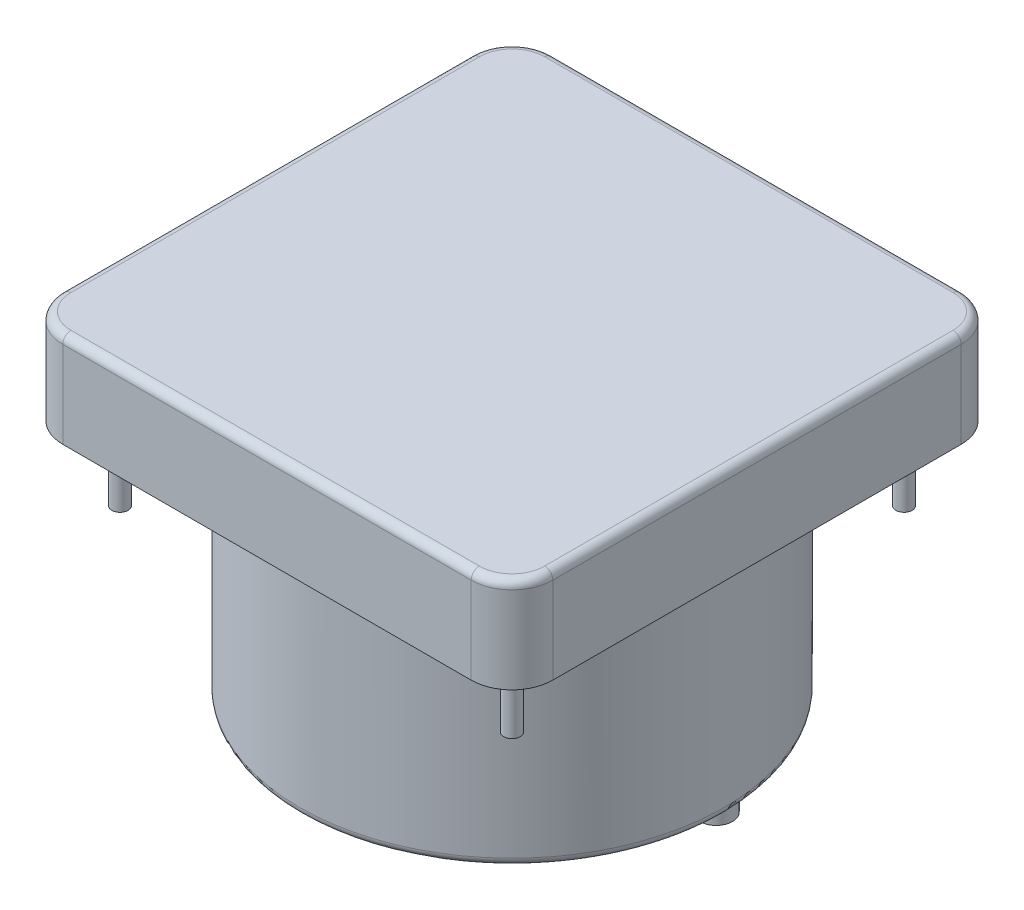
ISO-10303-21;
HEADER;
FILE_DESCRIPTION(('STEP AP214'),'2;1');
FILE_NAME('part.step','',(''),(''),'','','');
FILE_SCHEMA(('AUTOMOTIVE_DESIGN { 1 0 10303 214 1 1 1 1 }'));
ENDSEC;
DATA;
#1=APPLICATION_CONTEXT('core data for automotive mechanical design processes');
#2=APPLICATION_PROTOCOL_DEFINITION('international standard','automotive_design',2000,#1);
#3=PRODUCT_CONTEXT('',#1,'mechanical');
#4=PRODUCT('Part','Part','',(#3));
#5=PRODUCT_RELATED_PRODUCT_CATEGORY('part','',(#4));
#6=PRODUCT_DEFINITION_FORMATION('','',#4);
#7=PRODUCT_DEFINITION_CONTEXT('part definition',#1,'design');
#8=PRODUCT_DEFINITION('design','',#6,#7);
#9=PRODUCT_DEFINITION_SHAPE('','',#8);
#10=(LENGTH_UNIT() NAMED_UNIT(*) SI_UNIT(.MILLI.,.METRE.));
#11=(NAMED_UNIT(*) PLANE_ANGLE_UNIT() SI_UNIT($,.RADIAN.));
#12=(NAMED_UNIT(*) SI_UNIT($,.STERADIAN.) SOLID_ANGLE_UNIT());
#13=UNCERTAINTY_MEASURE_WITH_UNIT(LENGTH_MEASURE(1.E-05),#10,'distance_accuracy_value','');
#14=(GEOMETRIC_REPRESENTATION_CONTEXT(3) GLOBAL_UNCERTAINTY_ASSIGNED_CONTEXT((#13)) GLOBAL_UNIT_ASSIGNED_CONTEXT((#10,
#11,#12)) REPRESENTATION_CONTEXT('',''));
#15=CARTESIAN_POINT('',(0.,0.,0.));
#16=DIRECTION('',(0.,0.,1.));
#17=DIRECTION('',(1.,0.,0.));
#18=AXIS2_PLACEMENT_3D('',#15,#16,#17);
#19=CARTESIAN_POINT('',(0.,29.,0.));
#20=DIRECTION('',(0.,-1.,0.));
#21=DIRECTION('',(0.,0.,-1.));
#22=AXIS2_PLACEMENT_3D('',#19,#20,#21);
#23=CYLINDRICAL_SURFACE('',#22,26.);
#24=CARTESIAN_POINT('',(0.,1.,0.));
#25=DIRECTION('',(0.,1.,0.));
#26=DIRECTION('',(0.,0.,1.));
#27=AXIS2_PLACEMENT_3D('',#24,#25,#26);
#28=CIRCLE('',#27,26.);
#29=CARTESIAN_POINT('',(0.,1.,-26.));
#30=VERTEX_POINT('',#29);
#31=EDGE_CURVE('E212',#30,#30,#28,.T.);
#32=CARTESIAN_POINT('',(0.,29.,0.));
#33=DIRECTION('',(0.,1.,0.));
#34=DIRECTION('',(0.,0.,1.));
#35=AXIS2_PLACEMENT_3D('',#32,#33,#34);
#36=CIRCLE('',#35,26.);
#37=CARTESIAN_POINT('',(0.,29.,-26.));
#38=VERTEX_POINT('',#37);
#39=EDGE_CURVE('E158',#38,#38,#36,.T.);
#40=CARTESIAN_POINT('',(0.,1.,-26.));
#41=CARTESIAN_POINT('',(0.,1.29166666666667,-26.));
#42=CARTESIAN_POINT('',(0.,1.58333333333333,-26.));
#43=CARTESIAN_POINT('',(0.,2.16666666666667,-26.));
#44=CARTESIAN_POINT('',(0.,2.45833333333334,-26.));
#45=CARTESIAN_POINT('',(0.,3.04166666666667,-26.));
#46=CARTESIAN_POINT('',(0.,3.33333333333334,-26.));
#47=CARTESIAN_POINT('',(0.,3.91666666666667,-26.));
#48=CARTESIAN_POINT('',(0.,4.20833333333333,-26.));
#49=CARTESIAN_POINT('',(0.,4.79166666666667,-26.));
#50=CARTESIAN_POINT('',(0.,5.08333333333333,-26.));
#51=CARTESIAN_POINT('',(0.,5.66666666666667,-26.));
#52=CARTESIAN_POINT('',(0.,5.95833333333334,-26.));
#53=CARTESIAN_POINT('',(0.,6.54166666666667,-26.));
#54=CARTESIAN_POINT('',(0.,6.83333333333334,-26.));
#55=CARTESIAN_POINT('',(0.,7.41666666666667,-26.));
#56=CARTESIAN_POINT('',(0.,7.70833333333333,-26.));
#57=CARTESIAN_POINT('',(0.,8.29166666666667,-26.));
#58=CARTESIAN_POINT('',(0.,8.58333333333333,-26.));
#59=CARTESIAN_POINT('',(0.,9.16666666666667,-26.));
#60=CARTESIAN_POINT('',(0.,9.45833333333333,-26.));
#61=CARTESIAN_POINT('',(0.,10.0416666666667,-26.));
#62=CARTESIAN_POINT('',(0.,10.3333333333333,-26.));
#63=CARTESIAN_POINT('',(0.,10.9166666666667,-26.));
#64=CARTESIAN_POINT('',(0.,11.2083333333333,-26.));
#65=CARTESIAN_POINT('',(0.,11.7916666666667,-26.));
#66=CARTESIAN_POINT('',(0.,12.0833333333333,-26.));
#67=CARTESIAN_POINT('',(0.,12.6666666666667,-26.));
#68=CARTESIAN_POINT('',(0.,12.9583333333333,-26.));
#69=CARTESIAN_POINT('',(0.,13.5416666666667,-26.));
#70=CARTESIAN_POINT('',(0.,13.8333333333333,-26.));
#71=CARTESIAN_POINT('',(0.,14.4166666666667,-26.));
#72=CARTESIAN_POINT('',(0.,14.7083333333333,-26.));
#73=CARTESIAN_POINT('',(0.,15.2916666666667,-26.));
#74=CARTESIAN_POINT('',(0.,15.5833333333333,-26.));
#75=CARTESIAN_POINT('',(0.,16.1666666666667,-26.));
#76=CARTESIAN_POINT('',(0.,16.4583333333333,-26.));
#77=CARTESIAN_POINT('',(0.,17.0416666666667,-26.));
#78=CARTESIAN_POINT('',(0.,17.3333333333333,-26.));
#79=CARTESIAN_POINT('',(0.,17.9166666666667,-26.));
#80=CARTESIAN_POINT('',(0.,18.2083333333333,-26.));
#81=CARTESIAN_POINT('',(0.,18.7916666666667,-26.));
#82=CARTESIAN_POINT('',(0.,19.0833333333333,-26.));
#83=CARTESIAN_POINT('',(0.,19.6666666666667,-26.));
#84=CARTESIAN_POINT('',(0.,19.9583333333333,-26.));
#85=CARTESIAN_POINT('',(0.,20.5416666666667,-26.));
#86=CARTESIAN_POINT('',(0.,20.8333333333333,-26.));
#87=CARTESIAN_POINT('',(0.,21.4166666666667,-26.));
#88=CARTESIAN_POINT('',(0.,21.7083333333333,-26.));
#89=CARTESIAN_POINT('',(0.,22.2916666666667,-26.));
#90=CARTESIAN_POINT('',(0.,22.5833333333333,-26.));
#91=CARTESIAN_POINT('',(0.,23.1666666666667,-26.));
#92=CARTESIAN_POINT('',(0.,23.4583333333333,-26.));
#93=CARTESIAN_POINT('',(0.,24.0416666666667,-26.));
#94=CARTESIAN_POINT('',(0.,24.3333333333333,-26.));
#95=CARTESIAN_POINT('',(0.,24.9166666666667,-26.));
#96=CARTESIAN_POINT('',(0.,25.2083333333333,-26.));
#97=CARTESIAN_POINT('',(0.,25.7916666666667,-26.));
#98=CARTESIAN_POINT('',(0.,26.0833333333333,-26.));
#99=CARTESIAN_POINT('',(0.,26.6666666666667,-26.));
#100=CARTESIAN_POINT('',(0.,26.9583333333333,-26.));
#101=CARTESIAN_POINT('',(0.,27.5416666666667,-26.));
#102=CARTESIAN_POINT('',(0.,27.8333333333333,-26.));
#103=CARTESIAN_POINT('',(0.,28.4166666666667,-26.));
#104=CARTESIAN_POINT('',(0.,28.7083333333333,-26.));
#105=CARTESIAN_POINT('',(0.,29.,-26.));
#106=B_SPLINE_CURVE_WITH_KNOTS('',3,(#40,#41,#42,#43,#44,#45,#46,#47,#48,#49,#50,#51,#52,#53,
#54,#55,#56,#57,#58,#59,#60,#61,#62,#63,#64,#65,#66,#67,#68,#69,#70,#71,#72,#73,#74,#75,#76,#77,
#78,#79,#80,#81,#82,#83,#84,#85,#86,#87,#88,#89,#90,#91,#92,#93,#94,#95,#96,#97,#98,#99,#100,
#101,#102,#103,#104,#105),.UNSPECIFIED.,.F.,.F.,(4,2,2,2,2,2,2,2,2,2,2,2,2,2,2,2,2,2,2,2,2,2,2,
2,2,2,2,2,2,2,2,2,4),(0.,0.875000000000001,1.75,2.625,3.5,4.375,5.25,6.125,7.,7.875,8.75,9.625,
10.5,11.375,12.25,13.125,14.,14.875,15.75,16.625,17.5,18.375,19.25,20.125,21.,21.875,22.75,
23.625,24.5,25.375,26.25,27.125,28.),.UNSPECIFIED.);
#107=EDGE_CURVE('BSEAM36',#30,#38,#106,.T.);
#108=ORIENTED_EDGE('',*,*,#31,.T.);
#109=ORIENTED_EDGE('',*,*,#39,.F.);
#110=ORIENTED_EDGE('',*,*,#107,.T.);
#111=ORIENTED_EDGE('',*,*,#107,.F.);
#112=EDGE_LOOP('',(#108,#110,#109,#111));
#113=FACE_BOUND('',#112,.T.);
#114=ADVANCED_FACE('F36',(#113),#23,.T.);
#115=CARTESIAN_POINT('',(0.,0.,0.));
#116=DIRECTION('',(0.,1.,0.));
#117=DIRECTION('',(0.,0.,1.));
#118=AXIS2_PLACEMENT_3D('',#115,#116,#117);
#119=PLANE('',#118);
#120=CARTESIAN_POINT('',(-15.,0.,-10.));
#121=DIRECTION('',(0.,1.,0.));
#122=DIRECTION('',(0.,0.,1.));
#123=AXIS2_PLACEMENT_3D('',#120,#121,#122);
#124=CIRCLE('',#123,5.);
#125=CARTESIAN_POINT('',(-15.,0.,-5.));
#126=VERTEX_POINT('',#125);
#127=EDGE_CURVE('E11',#126,#126,#124,.F.);
#128=ORIENTED_EDGE('',*,*,#127,.F.);
#129=EDGE_LOOP('',(#128));
#130=FACE_BOUND('',#129,.T.);
#131=CARTESIAN_POINT('',(15.,0.,-10.));
#132=DIRECTION('',(0.,1.,0.));
#133=DIRECTION('',(0.,0.,1.));
#134=AXIS2_PLACEMENT_3D('',#131,#132,#133);
#135=CIRCLE('',#134,5.);
#136=CARTESIAN_POINT('',(15.,0.,-5.));
#137=VERTEX_POINT('',#136);
#138=EDGE_CURVE('E242',#137,#137,#135,.F.);
#139=ORIENTED_EDGE('',*,*,#138,.F.);
#140=EDGE_LOOP('',(#139));
#141=FACE_BOUND('',#140,.T.);
#142=CARTESIAN_POINT('',(0.,0.,0.));
#143=DIRECTION('',(0.,1.,0.));
#144=DIRECTION('',(0.,0.,1.));
#145=AXIS2_PLACEMENT_3D('',#142,#143,#144);
#146=CIRCLE('',#145,25.);
#147=CARTESIAN_POINT('',(0.,0.,25.));
#148=VERTEX_POINT('',#147);
#149=EDGE_CURVE('E239',#148,#148,#146,.F.);
#150=ORIENTED_EDGE('',*,*,#149,.T.);
#151=EDGE_LOOP('',(#150));
#152=FACE_BOUND('',#151,.T.);
#153=ADVANCED_FACE('F266',(#130,#141,#152),#119,.F.);
#154=CARTESIAN_POINT('',(30.,40.6,30.));
#155=DIRECTION('',(-1.,0.,0.));
#156=DIRECTION('',(0.,0.,1.));
#157=AXIS2_PLACEMENT_3D('',#154,#155,#156);
#158=PLANE('',#157);
#159=DIRECTION('',(0.,-1.,0.));
#160=VECTOR('',#159,1.);
#161=CARTESIAN_POINT('',(30.,40.6,-25.));
#162=LINE('',#161,#160);
#163=CARTESIAN_POINT('',(30.,29.,-25.));
#164=VERTEX_POINT('',#163);
#165=CARTESIAN_POINT('',(30.,39.6,-25.));
#166=VERTEX_POINT('',#165);
#167=EDGE_CURVE('E179',#164,#166,#162,.F.);
#168=ORIENTED_EDGE('',*,*,#167,.T.);
#169=DIRECTION('',(0.,0.,-1.));
#170=VECTOR('',#169,1.);
#171=CARTESIAN_POINT('',(30.,39.6,30.));
#172=LINE('',#171,#170);
#173=CARTESIAN_POINT('',(30.,39.6,25.));
#174=VERTEX_POINT('',#173);
#175=EDGE_CURVE('E205',#166,#174,#172,.F.);
#176=ORIENTED_EDGE('',*,*,#175,.T.);
#177=DIRECTION('',(0.,-1.,0.));
#178=VECTOR('',#177,1.);
#179=CARTESIAN_POINT('',(30.,40.6,25.));
#180=LINE('',#179,#178);
#181=CARTESIAN_POINT('',(30.,29.,25.));
#182=VERTEX_POINT('',#181);
#183=EDGE_CURVE('E177',#174,#182,#180,.T.);
#184=ORIENTED_EDGE('',*,*,#183,.T.);
#185=DIRECTION('',(0.,0.,-1.));
#186=VECTOR('',#185,1.);
#187=CARTESIAN_POINT('',(30.,29.,30.));
#188=LINE('',#187,#186);
#189=EDGE_CURVE('E160',#182,#164,#188,.T.);
#190=ORIENTED_EDGE('',*,*,#189,.T.);
#191=EDGE_LOOP('',(#168,#176,#184,#190));
#192=FACE_BOUND('',#191,.T.);
#193=ADVANCED_FACE('F272',(#192),#158,.F.);
#194=CARTESIAN_POINT('',(-30.,40.6,-30.));
#195=DIRECTION('',(0.,0.,1.));
#196=DIRECTION('',(1.,0.,0.));
#197=AXIS2_PLACEMENT_3D('',#194,#195,#196);
#198=PLANE('',#197);
#199=DIRECTION('',(0.,-1.,0.));
#200=VECTOR('',#199,1.);
#201=CARTESIAN_POINT('',(-25.,40.6,-30.));
#202=LINE('',#201,#200);
#203=CARTESIAN_POINT('',(-25.,29.,-30.));
#204=VERTEX_POINT('',#203);
#205=CARTESIAN_POINT('',(-25.,39.6,-30.));
#206=VERTEX_POINT('',#205);
#207=EDGE_CURVE('E144',#204,#206,#202,.F.);
#208=ORIENTED_EDGE('',*,*,#207,.T.);
#209=DIRECTION('',(-1.,0.,0.));
#210=VECTOR('',#209,1.);
#211=CARTESIAN_POINT('',(-30.,39.6,-30.));
#212=LINE('',#211,#210);
#213=CARTESIAN_POINT('',(25.,39.6,-30.));
#214=VERTEX_POINT('',#213);
#215=EDGE_CURVE('E201',#206,#214,#212,.F.);
#216=ORIENTED_EDGE('',*,*,#215,.T.);
#217=DIRECTION('',(0.,-1.,0.));
#218=VECTOR('',#217,1.);
#219=CARTESIAN_POINT('',(25.,40.6,-30.));
#220=LINE('',#219,#218);
#221=CARTESIAN_POINT('',(25.,29.,-30.));
#222=VERTEX_POINT('',#221);
#223=EDGE_CURVE('E148',#214,#222,#220,.T.);
#224=ORIENTED_EDGE('',*,*,#223,.T.);
#225=DIRECTION('',(-1.,0.,0.));
#226=VECTOR('',#225,1.);
#227=CARTESIAN_POINT('',(-30.,29.,-30.));
#228=LINE('',#227,#226);
#229=EDGE_CURVE('E155',#222,#204,#228,.T.);
#230=ORIENTED_EDGE('',*,*,#229,.T.);
#231=EDGE_LOOP('',(#208,#216,#224,#230));
#232=FACE_BOUND('',#231,.T.);
#233=ADVANCED_FACE('F343',(#232),#198,.F.);
#234=CARTESIAN_POINT('',(-30.,40.6,30.));
#235=DIRECTION('',(1.,0.,0.));
#236=DIRECTION('',(0.,0.,-1.));
#237=AXIS2_PLACEMENT_3D('',#234,#235,#236);
#238=PLANE('',#237);
#239=DIRECTION('',(0.,-1.,0.));
#240=VECTOR('',#239,1.);
#241=CARTESIAN_POINT('',(-30.,40.6,25.));
#242=LINE('',#241,#240);
#243=CARTESIAN_POINT('',(-30.,29.,25.));
#244=VERTEX_POINT('',#243);
#245=CARTESIAN_POINT('',(-30.,39.6,25.));
#246=VERTEX_POINT('',#245);
#247=EDGE_CURVE('E138',#244,#246,#242,.F.);
#248=ORIENTED_EDGE('',*,*,#247,.T.);
#249=DIRECTION('',(0.,0.,1.));
#250=VECTOR('',#249,1.);
#251=CARTESIAN_POINT('',(-30.,39.6,30.));
#252=LINE('',#251,#250);
#253=CARTESIAN_POINT('',(-30.,39.6,-25.));
#254=VERTEX_POINT('',#253);
#255=EDGE_CURVE('E133',#246,#254,#252,.F.);
#256=ORIENTED_EDGE('',*,*,#255,.T.);
#257=DIRECTION('',(0.,-1.,0.));
#258=VECTOR('',#257,1.);
#259=CARTESIAN_POINT('',(-30.,40.6,-25.));
#260=LINE('',#259,#258);
#261=CARTESIAN_POINT('',(-30.,29.,-25.));
#262=VERTEX_POINT('',#261);
#263=EDGE_CURVE('E127',#254,#262,#260,.T.);
#264=ORIENTED_EDGE('',*,*,#263,.T.);
#265=DIRECTION('',(0.,0.,1.));
#266=VECTOR('',#265,1.);
#267=CARTESIAN_POINT('',(-30.,29.,30.));
#268=LINE('',#267,#266);
#269=EDGE_CURVE('E131',#262,#244,#268,.T.);
#270=ORIENTED_EDGE('',*,*,#269,.T.);
#271=EDGE_LOOP('',(#248,#256,#264,#270));
#272=FACE_BOUND('',#271,.T.);
#273=ADVANCED_FACE('F129',(#272),#238,.F.);
#274=CARTESIAN_POINT('',(-30.,40.6,30.));
#275=DIRECTION('',(0.,0.,-1.));
#276=DIRECTION('',(-1.,0.,0.));
#277=AXIS2_PLACEMENT_3D('',#274,#275,#276);
#278=PLANE('',#277);
#279=DIRECTION('',(0.,-1.,0.));
#280=VECTOR('',#279,1.);
#281=CARTESIAN_POINT('',(25.,40.6,30.));
#282=LINE('',#281,#280);
#283=CARTESIAN_POINT('',(25.,29.,30.));
#284=VERTEX_POINT('',#283);
#285=CARTESIAN_POINT('',(25.,39.6,30.));
#286=VERTEX_POINT('',#285);
#287=EDGE_CURVE('E173',#284,#286,#282,.F.);
#288=ORIENTED_EDGE('',*,*,#287,.T.);
#289=DIRECTION('',(1.,0.,0.));
#290=VECTOR('',#289,1.);
#291=CARTESIAN_POINT('',(-30.,39.6,30.));
#292=LINE('',#291,#290);
#293=CARTESIAN_POINT('',(-25.,39.6,30.));
#294=VERTEX_POINT('',#293);
#295=EDGE_CURVE('E59',#286,#294,#292,.F.);
#296=ORIENTED_EDGE('',*,*,#295,.T.);
#297=DIRECTION('',(0.,-1.,0.));
#298=VECTOR('',#297,1.);
#299=CARTESIAN_POINT('',(-25.,40.6,30.));
#300=LINE('',#299,#298);
#301=CARTESIAN_POINT('',(-25.,29.,30.));
#302=VERTEX_POINT('',#301);
#303=EDGE_CURVE('E175',#294,#302,#300,.T.);
#304=ORIENTED_EDGE('',*,*,#303,.T.);
#305=DIRECTION('',(1.,0.,0.));
#306=VECTOR('',#305,1.);
#307=CARTESIAN_POINT('',(-30.,29.,30.));
#308=LINE('',#307,#306);
#309=EDGE_CURVE('E154',#302,#284,#308,.T.);
#310=ORIENTED_EDGE('',*,*,#309,.T.);
#311=EDGE_LOOP('',(#288,#296,#304,#310));
#312=FACE_BOUND('',#311,.T.);
#313=ADVANCED_FACE('F363',(#312),#278,.F.);
#314=CARTESIAN_POINT('',(0.,40.6,0.));
#315=DIRECTION('',(0.,-1.,0.));
#316=DIRECTION('',(0.,0.,-1.));
#317=AXIS2_PLACEMENT_3D('',#314,#315,#316);
#318=PLANE('',#317);
#319=DIRECTION('',(-1.,0.,0.));
#320=VECTOR('',#319,1.);
#321=CARTESIAN_POINT('',(0.,40.6,-29.));
#322=LINE('',#321,#320);
#323=CARTESIAN_POINT('',(25.,40.6,-29.));
#324=VERTEX_POINT('',#323);
#325=CARTESIAN_POINT('',(-25.,40.6,-29.));
#326=VERTEX_POINT('',#325);
#327=EDGE_CURVE('E194',#324,#326,#322,.T.);
#328=ORIENTED_EDGE('',*,*,#327,.T.);
#329=CARTESIAN_POINT('',(-25.,40.6,-25.));
#330=DIRECTION('',(0.,-1.,0.));
#331=DIRECTION('',(0.,0.,-1.));
#332=AXIS2_PLACEMENT_3D('',#329,#330,#331);
#333=CIRCLE('',#332,4.);
#334=CARTESIAN_POINT('',(-29.,40.6,-25.));
#335=VERTEX_POINT('',#334);
#336=EDGE_CURVE('E196',#326,#335,#333,.F.);
#337=ORIENTED_EDGE('',*,*,#336,.T.);
#338=DIRECTION('',(0.,0.,1.));
#339=VECTOR('',#338,1.);
#340=CARTESIAN_POINT('',(-29.,40.6,0.));
#341=LINE('',#340,#339);
#342=CARTESIAN_POINT('',(-29.,40.6,25.));
#343=VERTEX_POINT('',#342);
#344=EDGE_CURVE('E182',#335,#343,#341,.T.);
#345=ORIENTED_EDGE('',*,*,#344,.T.);
#346=CARTESIAN_POINT('',(-25.,40.6,25.));
#347=DIRECTION('',(0.,-1.,0.));
#348=DIRECTION('',(0.,0.,-1.));
#349=AXIS2_PLACEMENT_3D('',#346,#347,#348);
#350=CIRCLE('',#349,4.);
#351=CARTESIAN_POINT('',(-25.,40.6,29.));
#352=VERTEX_POINT('',#351);
#353=EDGE_CURVE('E184',#343,#352,#350,.F.);
#354=ORIENTED_EDGE('',*,*,#353,.T.);
#355=DIRECTION('',(1.,0.,0.));
#356=VECTOR('',#355,1.);
#357=CARTESIAN_POINT('',(0.,40.6,29.));
#358=LINE('',#357,#356);
#359=CARTESIAN_POINT('',(25.,40.6,29.));
#360=VERTEX_POINT('',#359);
#361=EDGE_CURVE('E186',#352,#360,#358,.T.);
#362=ORIENTED_EDGE('',*,*,#361,.T.);
#363=CARTESIAN_POINT('',(25.,40.6,25.));
#364=DIRECTION('',(0.,-1.,0.));
#365=DIRECTION('',(0.,0.,-1.));
#366=AXIS2_PLACEMENT_3D('',#363,#364,#365);
#367=CIRCLE('',#366,4.);
#368=CARTESIAN_POINT('',(29.,40.6,25.));
#369=VERTEX_POINT('',#368);
#370=EDGE_CURVE('E188',#360,#369,#367,.F.);
#371=ORIENTED_EDGE('',*,*,#370,.T.);
#372=DIRECTION('',(0.,0.,-1.));
#373=VECTOR('',#372,1.);
#374=CARTESIAN_POINT('',(29.,40.6,0.));
#375=LINE('',#374,#373);
#376=CARTESIAN_POINT('',(29.,40.6,-25.));
#377=VERTEX_POINT('',#376);
#378=EDGE_CURVE('E190',#369,#377,#375,.T.);
#379=ORIENTED_EDGE('',*,*,#378,.T.);
#380=CARTESIAN_POINT('',(25.,40.6,-25.));
#381=DIRECTION('',(0.,-1.,0.));
#382=DIRECTION('',(0.,0.,-1.));
#383=AXIS2_PLACEMENT_3D('',#380,#381,#382);
#384=CIRCLE('',#383,4.);
#385=EDGE_CURVE('E192',#377,#324,#384,.F.);
#386=ORIENTED_EDGE('',*,*,#385,.T.);
#387=EDGE_LOOP('',(#328,#337,#345,#354,#362,#371,#379,#386));
#388=FACE_BOUND('',#387,.T.);
#389=ADVANCED_FACE('F360',(#388),#318,.F.);
#390=CARTESIAN_POINT('',(0.,29.,0.));
#391=DIRECTION('',(0.,-1.,0.));
#392=DIRECTION('',(0.,0.,-1.));
#393=AXIS2_PLACEMENT_3D('',#390,#391,#392);
#394=PLANE('',#393);
#395=CARTESIAN_POINT('',(-24.,29.,-24.));
#396=DIRECTION('',(0.,-1.,0.));
#397=DIRECTION('',(0.,0.,1.));
#398=AXIS2_PLACEMENT_3D('',#395,#396,#397);
#399=CIRCLE('',#398,1.);
#400=CARTESIAN_POINT('',(-24.,29.,-23.));
#401=VERTEX_POINT('',#400);
#402=EDGE_CURVE('E236',#401,#401,#399,.T.);
#403=ORIENTED_EDGE('',*,*,#402,.F.);
#404=EDGE_LOOP('',(#403));
#405=FACE_BOUND('',#404,.T.);
#406=CARTESIAN_POINT('',(-24.,29.,24.));
#407=DIRECTION('',(0.,-1.,0.));
#408=DIRECTION('',(0.,0.,-1.));
#409=AXIS2_PLACEMENT_3D('',#406,#407,#408);
#410=CIRCLE('',#409,1.);
#411=CARTESIAN_POINT('',(-24.,29.,23.));
#412=VERTEX_POINT('',#411);
#413=EDGE_CURVE('E640',#412,#412,#410,.T.);
#414=ORIENTED_EDGE('',*,*,#413,.F.);
#415=EDGE_LOOP('',(#414));
#416=FACE_BOUND('',#415,.T.);
#417=CARTESIAN_POINT('',(24.,29.,24.));
#418=DIRECTION('',(0.,-1.,0.));
#419=DIRECTION('',(0.,0.,1.));
#420=AXIS2_PLACEMENT_3D('',#417,#418,#419);
#421=CIRCLE('',#420,1.);
#422=CARTESIAN_POINT('',(24.,29.,25.));
#423=VERTEX_POINT('',#422);
#424=EDGE_CURVE('E647',#423,#423,#421,.T.);
#425=ORIENTED_EDGE('',*,*,#424,.F.);
#426=EDGE_LOOP('',(#425));
#427=FACE_BOUND('',#426,.T.);
#428=CARTESIAN_POINT('',(24.,29.,-24.));
#429=DIRECTION('',(0.,-1.,0.));
#430=DIRECTION('',(0.,0.,-1.));
#431=AXIS2_PLACEMENT_3D('',#428,#429,#430);
#432=CIRCLE('',#431,1.);
#433=CARTESIAN_POINT('',(24.,29.,-25.));
#434=VERTEX_POINT('',#433);
#435=EDGE_CURVE('E653',#434,#434,#432,.T.);
#436=ORIENTED_EDGE('',*,*,#435,.F.);
#437=EDGE_LOOP('',(#436));
#438=FACE_BOUND('',#437,.T.);
#439=ORIENTED_EDGE('',*,*,#39,.T.);
#440=EDGE_LOOP('',(#439));
#441=FACE_BOUND('',#440,.T.);
#442=ORIENTED_EDGE('',*,*,#269,.F.);
#443=CARTESIAN_POINT('',(-25.,29.,-25.));
#444=DIRECTION('',(0.,-1.,0.));
#445=DIRECTION('',(0.,0.,-1.));
#446=AXIS2_PLACEMENT_3D('',#443,#444,#445);
#447=CIRCLE('',#446,5.);
#448=EDGE_CURVE('E141',#262,#204,#447,.T.);
#449=ORIENTED_EDGE('',*,*,#448,.T.);
#450=ORIENTED_EDGE('',*,*,#229,.F.);
#451=CARTESIAN_POINT('',(25.,29.,-25.));
#452=DIRECTION('',(0.,-1.,0.));
#453=DIRECTION('',(0.,0.,-1.));
#454=AXIS2_PLACEMENT_3D('',#451,#452,#453);
#455=CIRCLE('',#454,5.);
#456=EDGE_CURVE('E168',#222,#164,#455,.T.);
#457=ORIENTED_EDGE('',*,*,#456,.T.);
#458=ORIENTED_EDGE('',*,*,#189,.F.);
#459=CARTESIAN_POINT('',(25.,29.,25.));
#460=DIRECTION('',(0.,-1.,0.));
#461=DIRECTION('',(0.,0.,-1.));
#462=AXIS2_PLACEMENT_3D('',#459,#460,#461);
#463=CIRCLE('',#462,5.);
#464=EDGE_CURVE('E137',#182,#284,#463,.T.);
#465=ORIENTED_EDGE('',*,*,#464,.T.);
#466=ORIENTED_EDGE('',*,*,#309,.F.);
#467=CARTESIAN_POINT('',(-25.,29.,25.));
#468=DIRECTION('',(0.,-1.,0.));
#469=DIRECTION('',(0.,0.,-1.));
#470=AXIS2_PLACEMENT_3D('',#467,#468,#469);
#471=CIRCLE('',#470,5.);
#472=EDGE_CURVE('E149',#302,#244,#471,.T.);
#473=ORIENTED_EDGE('',*,*,#472,.T.);
#474=EDGE_LOOP('',(#442,#449,#450,#457,#458,#465,#466,#473));
#475=FACE_BOUND('',#474,.T.);
#476=ADVANCED_FACE('F151',(#405,#416,#427,#438,#441,#475),#394,.T.);
#477=CARTESIAN_POINT('',(-25.,40.6,-25.));
#478=DIRECTION('',(0.,-1.,0.));
#479=DIRECTION('',(0.,0.,-1.));
#480=AXIS2_PLACEMENT_3D('',#477,#478,#479);
#481=CYLINDRICAL_SURFACE('',#480,5.);
#482=ORIENTED_EDGE('',*,*,#263,.F.);
#483=CARTESIAN_POINT('',(-25.,39.6,-25.));
#484=DIRECTION('',(0.,-1.,0.));
#485=DIRECTION('',(0.,0.,-1.));
#486=AXIS2_PLACEMENT_3D('',#483,#484,#485);
#487=CIRCLE('',#486,5.);
#488=EDGE_CURVE('E199',#254,#206,#487,.T.);
#489=ORIENTED_EDGE('',*,*,#488,.T.);
#490=ORIENTED_EDGE('',*,*,#207,.F.);
#491=ORIENTED_EDGE('',*,*,#448,.F.);
#492=EDGE_LOOP('',(#482,#489,#490,#491));
#493=FACE_BOUND('',#492,.T.);
#494=ADVANCED_FACE('F142',(#493),#481,.T.);
#495=CARTESIAN_POINT('',(-25.,40.6,25.));
#496=DIRECTION('',(0.,-1.,0.));
#497=DIRECTION('',(0.,0.,-1.));
#498=AXIS2_PLACEMENT_3D('',#495,#496,#497);
#499=CYLINDRICAL_SURFACE('',#498,5.);
#500=ORIENTED_EDGE('',*,*,#303,.F.);
#501=CARTESIAN_POINT('',(-25.,39.6,25.));
#502=DIRECTION('',(0.,-1.,0.));
#503=DIRECTION('',(0.,0.,-1.));
#504=AXIS2_PLACEMENT_3D('',#501,#502,#503);
#505=CIRCLE('',#504,5.);
#506=EDGE_CURVE('E51',#294,#246,#505,.T.);
#507=ORIENTED_EDGE('',*,*,#506,.T.);
#508=ORIENTED_EDGE('',*,*,#247,.F.);
#509=ORIENTED_EDGE('',*,*,#472,.F.);
#510=EDGE_LOOP('',(#500,#507,#508,#509));
#511=FACE_BOUND('',#510,.T.);
#512=ADVANCED_FACE('F280',(#511),#499,.T.);
#513=CARTESIAN_POINT('',(25.,40.6,-25.));
#514=DIRECTION('',(0.,-1.,0.));
#515=DIRECTION('',(0.,0.,-1.));
#516=AXIS2_PLACEMENT_3D('',#513,#514,#515);
#517=CYLINDRICAL_SURFACE('',#516,5.);
#518=ORIENTED_EDGE('',*,*,#223,.F.);
#519=CARTESIAN_POINT('',(25.,39.6,-25.));
#520=DIRECTION('',(0.,-1.,0.));
#521=DIRECTION('',(0.,0.,-1.));
#522=AXIS2_PLACEMENT_3D('',#519,#520,#521);
#523=CIRCLE('',#522,5.);
#524=EDGE_CURVE('E203',#214,#166,#523,.T.);
#525=ORIENTED_EDGE('',*,*,#524,.T.);
#526=ORIENTED_EDGE('',*,*,#167,.F.);
#527=ORIENTED_EDGE('',*,*,#456,.F.);
#528=EDGE_LOOP('',(#518,#525,#526,#527));
#529=FACE_BOUND('',#528,.T.);
#530=ADVANCED_FACE('F283',(#529),#517,.T.);
#531=CARTESIAN_POINT('',(25.,40.6,25.));
#532=DIRECTION('',(0.,-1.,0.));
#533=DIRECTION('',(0.,0.,-1.));
#534=AXIS2_PLACEMENT_3D('',#531,#532,#533);
#535=CYLINDRICAL_SURFACE('',#534,5.);
#536=ORIENTED_EDGE('',*,*,#183,.F.);
#537=CARTESIAN_POINT('',(25.,39.6,25.));
#538=DIRECTION('',(0.,-1.,0.));
#539=DIRECTION('',(0.,0.,-1.));
#540=AXIS2_PLACEMENT_3D('',#537,#538,#539);
#541=CIRCLE('',#540,5.);
#542=EDGE_CURVE('E207',#174,#286,#541,.T.);
#543=ORIENTED_EDGE('',*,*,#542,.T.);
#544=ORIENTED_EDGE('',*,*,#287,.F.);
#545=ORIENTED_EDGE('',*,*,#464,.F.);
#546=EDGE_LOOP('',(#536,#543,#544,#545));
#547=FACE_BOUND('',#546,.T.);
#548=ADVANCED_FACE('F286',(#547),#535,.T.);
#549=CARTESIAN_POINT('',(24.,20.,-24.));
#550=DIRECTION('',(0.,1.,0.));
#551=DIRECTION('',(0.,0.,1.));
#552=AXIS2_PLACEMENT_3D('',#549,#550,#551);
#553=CYLINDRICAL_SURFACE('',#552,1.);
#554=CARTESIAN_POINT('',(24.,20.,-24.));
#555=DIRECTION('',(0.,-1.,0.));
#556=DIRECTION('',(0.,0.,-1.));
#557=AXIS2_PLACEMENT_3D('',#554,#555,#556);
#558=CIRCLE('',#557,1.);
#559=CARTESIAN_POINT('',(24.,20.,-25.));
#560=VERTEX_POINT('',#559);
#561=EDGE_CURVE('E656',#560,#560,#558,.T.);
#562=ORIENTED_EDGE('',*,*,#561,.F.);
#563=EDGE_LOOP('',(#562));
#564=FACE_BOUND('',#563,.T.);
#565=ORIENTED_EDGE('',*,*,#435,.T.);
#566=EDGE_LOOP('',(#565));
#567=FACE_BOUND('',#566,.T.);
#568=ADVANCED_FACE('F290',(#564,#567),#553,.T.);
#569=CARTESIAN_POINT('',(24.,20.,-24.));
#570=DIRECTION('',(0.,-1.,0.));
#571=DIRECTION('',(0.,0.,-1.));
#572=AXIS2_PLACEMENT_3D('',#569,#570,#571);
#573=PLANE('',#572);
#574=ORIENTED_EDGE('',*,*,#561,.T.);
#575=EDGE_LOOP('',(#574));
#576=FACE_BOUND('',#575,.T.);
#577=ADVANCED_FACE('F566',(#576),#573,.T.);
#578=CARTESIAN_POINT('',(24.,20.,24.));
#579=DIRECTION('',(0.,1.,0.));
#580=DIRECTION('',(0.,0.,1.));
#581=AXIS2_PLACEMENT_3D('',#578,#579,#580);
#582=CYLINDRICAL_SURFACE('',#581,1.);
#583=CARTESIAN_POINT('',(24.,20.,24.));
#584=DIRECTION('',(0.,-1.,0.));
#585=DIRECTION('',(0.,0.,1.));
#586=AXIS2_PLACEMENT_3D('',#583,#584,#585);
#587=CIRCLE('',#586,1.);
#588=CARTESIAN_POINT('',(24.,20.,25.));
#589=VERTEX_POINT('',#588);
#590=EDGE_CURVE('E650',#589,#589,#587,.T.);
#591=ORIENTED_EDGE('',*,*,#590,.F.);
#592=EDGE_LOOP('',(#591));
#593=FACE_BOUND('',#592,.T.);
#594=ORIENTED_EDGE('',*,*,#424,.T.);
#595=EDGE_LOOP('',(#594));
#596=FACE_BOUND('',#595,.T.);
#597=ADVANCED_FACE('F576',(#593,#596),#582,.T.);
#598=CARTESIAN_POINT('',(24.,20.,24.));
#599=DIRECTION('',(0.,1.,0.));
#600=DIRECTION('',(0.,0.,1.));
#601=AXIS2_PLACEMENT_3D('',#598,#599,#600);
#602=PLANE('',#601);
#603=ORIENTED_EDGE('',*,*,#590,.T.);
#604=EDGE_LOOP('',(#603));
#605=FACE_BOUND('',#604,.T.);
#606=ADVANCED_FACE('F586',(#605),#602,.F.);
#607=CARTESIAN_POINT('',(-24.,20.,24.));
#608=DIRECTION('',(0.,1.,0.));
#609=DIRECTION('',(0.,0.,1.));
#610=AXIS2_PLACEMENT_3D('',#607,#608,#609);
#611=CYLINDRICAL_SURFACE('',#610,1.);
#612=CARTESIAN_POINT('',(-24.,20.,24.));
#613=DIRECTION('',(0.,-1.,0.));
#614=DIRECTION('',(0.,0.,-1.));
#615=AXIS2_PLACEMENT_3D('',#612,#613,#614);
#616=CIRCLE('',#615,1.);
#617=CARTESIAN_POINT('',(-24.,20.,23.));
#618=VERTEX_POINT('',#617);
#619=EDGE_CURVE('E644',#618,#618,#616,.T.);
#620=ORIENTED_EDGE('',*,*,#619,.F.);
#621=EDGE_LOOP('',(#620));
#622=FACE_BOUND('',#621,.T.);
#623=ORIENTED_EDGE('',*,*,#413,.T.);
#624=EDGE_LOOP('',(#623));
#625=FACE_BOUND('',#624,.T.);
#626=ADVANCED_FACE('F596',(#622,#625),#611,.T.);
#627=CARTESIAN_POINT('',(-24.,20.,24.));
#628=DIRECTION('',(0.,-1.,0.));
#629=DIRECTION('',(0.,0.,-1.));
#630=AXIS2_PLACEMENT_3D('',#627,#628,#629);
#631=PLANE('',#630);
#632=ORIENTED_EDGE('',*,*,#619,.T.);
#633=EDGE_LOOP('',(#632));
#634=FACE_BOUND('',#633,.T.);
#635=ADVANCED_FACE('F606',(#634),#631,.T.);
#636=CARTESIAN_POINT('',(-24.,20.,-24.));
#637=DIRECTION('',(0.,1.,0.));
#638=DIRECTION('',(0.,0.,1.));
#639=AXIS2_PLACEMENT_3D('',#636,#637,#638);
#640=CYLINDRICAL_SURFACE('',#639,1.);
#641=CARTESIAN_POINT('',(-24.,20.,-24.));
#642=DIRECTION('',(0.,-1.,0.));
#643=DIRECTION('',(0.,0.,1.));
#644=AXIS2_PLACEMENT_3D('',#641,#642,#643);
#645=CIRCLE('',#644,1.);
#646=CARTESIAN_POINT('',(-24.,20.,-23.));
#647=VERTEX_POINT('',#646);
#648=EDGE_CURVE('E636',#647,#647,#645,.T.);
#649=ORIENTED_EDGE('',*,*,#648,.F.);
#650=EDGE_LOOP('',(#649));
#651=FACE_BOUND('',#650,.T.);
#652=ORIENTED_EDGE('',*,*,#402,.T.);
#653=EDGE_LOOP('',(#652));
#654=FACE_BOUND('',#653,.T.);
#655=ADVANCED_FACE('F326',(#651,#654),#640,.T.);
#656=CARTESIAN_POINT('',(-24.,20.,-24.));
#657=DIRECTION('',(0.,1.,0.));
#658=DIRECTION('',(0.,0.,1.));
#659=AXIS2_PLACEMENT_3D('',#656,#657,#658);
#660=PLANE('',#659);
#661=ORIENTED_EDGE('',*,*,#648,.T.);
#662=EDGE_LOOP('',(#661));
#663=FACE_BOUND('',#662,.T.);
#664=ADVANCED_FACE('F321',(#663),#660,.F.);
#665=CARTESIAN_POINT('',(25.,39.6,25.));
#666=DIRECTION('',(0.,-1.,0.));
#667=DIRECTION('',(0.,0.,-1.));
#668=AXIS2_PLACEMENT_3D('',#665,#666,#667);
#669=TOROIDAL_SURFACE('',#668,4.,1.);
#670=CARTESIAN_POINT('',(25.,39.6,29.));
#671=DIRECTION('',(-1.,0.,0.));
#672=DIRECTION('',(0.,0.,1.));
#673=AXIS2_PLACEMENT_3D('',#670,#671,#672);
#674=CIRCLE('',#673,1.);
#675=EDGE_CURVE('E230',#286,#360,#674,.T.);
#676=ORIENTED_EDGE('',*,*,#675,.F.);
#677=ORIENTED_EDGE('',*,*,#542,.F.);
#678=CARTESIAN_POINT('',(29.,39.6,25.));
#679=DIRECTION('',(0.,0.,-1.));
#680=DIRECTION('',(-1.,0.,0.));
#681=AXIS2_PLACEMENT_3D('',#678,#679,#680);
#682=CIRCLE('',#681,1.);
#683=EDGE_CURVE('E233',#369,#174,#682,.T.);
#684=ORIENTED_EDGE('',*,*,#683,.F.);
#685=ORIENTED_EDGE('',*,*,#370,.F.);
#686=EDGE_LOOP('',(#676,#677,#684,#685));
#687=FACE_BOUND('',#686,.T.);
#688=ADVANCED_FACE('F318',(#687),#669,.T.);
#689=CARTESIAN_POINT('',(29.,39.6,0.));
#690=DIRECTION('',(0.,0.,-1.));
#691=DIRECTION('',(-1.,0.,0.));
#692=AXIS2_PLACEMENT_3D('',#689,#690,#691);
#693=CYLINDRICAL_SURFACE('',#692,1.);
#694=ORIENTED_EDGE('',*,*,#683,.T.);
#695=ORIENTED_EDGE('',*,*,#175,.F.);
#696=CARTESIAN_POINT('',(29.,39.6,-25.));
#697=DIRECTION('',(0.,0.,-1.));
#698=DIRECTION('',(-1.,0.,0.));
#699=AXIS2_PLACEMENT_3D('',#696,#697,#698);
#700=CIRCLE('',#699,1.);
#701=EDGE_CURVE('E227',#377,#166,#700,.T.);
#702=ORIENTED_EDGE('',*,*,#701,.F.);
#703=ORIENTED_EDGE('',*,*,#378,.F.);
#704=EDGE_LOOP('',(#694,#695,#702,#703));
#705=FACE_BOUND('',#704,.T.);
#706=ADVANCED_FACE('F315',(#705),#693,.T.);
#707=CARTESIAN_POINT('',(0.,39.6,29.));
#708=DIRECTION('',(1.,0.,0.));
#709=DIRECTION('',(0.,0.,-1.));
#710=AXIS2_PLACEMENT_3D('',#707,#708,#709);
#711=CYLINDRICAL_SURFACE('',#710,1.);
#712=ORIENTED_EDGE('',*,*,#675,.T.);
#713=ORIENTED_EDGE('',*,*,#361,.F.);
#714=CARTESIAN_POINT('',(-25.,39.6,29.));
#715=DIRECTION('',(-1.,0.,0.));
#716=DIRECTION('',(0.,0.,1.));
#717=AXIS2_PLACEMENT_3D('',#714,#715,#716);
#718=CIRCLE('',#717,1.);
#719=EDGE_CURVE('E224',#294,#352,#718,.T.);
#720=ORIENTED_EDGE('',*,*,#719,.F.);
#721=ORIENTED_EDGE('',*,*,#295,.F.);
#722=EDGE_LOOP('',(#712,#713,#720,#721));
#723=FACE_BOUND('',#722,.T.);
#724=ADVANCED_FACE('F311',(#723),#711,.T.);
#725=CARTESIAN_POINT('',(25.,39.6,-25.));
#726=DIRECTION('',(0.,-1.,0.));
#727=DIRECTION('',(0.,0.,-1.));
#728=AXIS2_PLACEMENT_3D('',#725,#726,#727);
#729=TOROIDAL_SURFACE('',#728,4.,1.);
#730=ORIENTED_EDGE('',*,*,#701,.T.);
#731=ORIENTED_EDGE('',*,*,#524,.F.);
#732=CARTESIAN_POINT('',(25.,39.6,-29.));
#733=DIRECTION('',(-1.,0.,0.));
#734=DIRECTION('',(0.,0.,1.));
#735=AXIS2_PLACEMENT_3D('',#732,#733,#734);
#736=CIRCLE('',#735,1.);
#737=EDGE_CURVE('E221',#324,#214,#736,.T.);
#738=ORIENTED_EDGE('',*,*,#737,.F.);
#739=ORIENTED_EDGE('',*,*,#385,.F.);
#740=EDGE_LOOP('',(#730,#731,#738,#739));
#741=FACE_BOUND('',#740,.T.);
#742=ADVANCED_FACE('F307',(#741),#729,.T.);
#743=CARTESIAN_POINT('',(-25.,39.6,25.));
#744=DIRECTION('',(0.,-1.,0.));
#745=DIRECTION('',(0.,0.,-1.));
#746=AXIS2_PLACEMENT_3D('',#743,#744,#745);
#747=TOROIDAL_SURFACE('',#746,4.,1.);
#748=ORIENTED_EDGE('',*,*,#719,.T.);
#749=ORIENTED_EDGE('',*,*,#353,.F.);
#750=CARTESIAN_POINT('',(-29.,39.6,25.));
#751=DIRECTION('',(0.,0.,-1.));
#752=DIRECTION('',(-1.,0.,0.));
#753=AXIS2_PLACEMENT_3D('',#750,#751,#752);
#754=CIRCLE('',#753,1.);
#755=EDGE_CURVE('E218',#246,#343,#754,.T.);
#756=ORIENTED_EDGE('',*,*,#755,.F.);
#757=ORIENTED_EDGE('',*,*,#506,.F.);
#758=EDGE_LOOP('',(#748,#749,#756,#757));
#759=FACE_BOUND('',#758,.T.);
#760=ADVANCED_FACE('F303',(#759),#747,.T.);
#761=CARTESIAN_POINT('',(0.,39.6,-29.));
#762=DIRECTION('',(-1.,0.,0.));
#763=DIRECTION('',(0.,0.,1.));
#764=AXIS2_PLACEMENT_3D('',#761,#762,#763);
#765=CYLINDRICAL_SURFACE('',#764,1.);
#766=ORIENTED_EDGE('',*,*,#737,.T.);
#767=ORIENTED_EDGE('',*,*,#215,.F.);
#768=CARTESIAN_POINT('',(-25.,39.6,-29.));
#769=DIRECTION('',(-1.,0.,0.));
#770=DIRECTION('',(0.,0.,1.));
#771=AXIS2_PLACEMENT_3D('',#768,#769,#770);
#772=CIRCLE('',#771,1.);
#773=EDGE_CURVE('E215',#326,#206,#772,.T.);
#774=ORIENTED_EDGE('',*,*,#773,.F.);
#775=ORIENTED_EDGE('',*,*,#327,.F.);
#776=EDGE_LOOP('',(#766,#767,#774,#775));
#777=FACE_BOUND('',#776,.T.);
#778=ADVANCED_FACE('F299',(#777),#765,.T.);
#779=CARTESIAN_POINT('',(-29.,39.6,0.));
#780=DIRECTION('',(0.,0.,1.));
#781=DIRECTION('',(1.,0.,0.));
#782=AXIS2_PLACEMENT_3D('',#779,#780,#781);
#783=CYLINDRICAL_SURFACE('',#782,1.);
#784=ORIENTED_EDGE('',*,*,#755,.T.);
#785=ORIENTED_EDGE('',*,*,#344,.F.);
#786=CARTESIAN_POINT('',(-29.,39.6,-25.));
#787=DIRECTION('',(0.,0.,-1.));
#788=DIRECTION('',(-1.,0.,0.));
#789=AXIS2_PLACEMENT_3D('',#786,#787,#788);
#790=CIRCLE('',#789,1.);
#791=EDGE_CURVE('E213',#254,#335,#790,.T.);
#792=ORIENTED_EDGE('',*,*,#791,.F.);
#793=ORIENTED_EDGE('',*,*,#255,.F.);
#794=EDGE_LOOP('',(#784,#785,#792,#793));
#795=FACE_BOUND('',#794,.T.);
#796=ADVANCED_FACE('F295',(#795),#783,.T.);
#797=CARTESIAN_POINT('',(-25.,39.6,-25.));
#798=DIRECTION('',(0.,-1.,0.));
#799=DIRECTION('',(0.,0.,-1.));
#800=AXIS2_PLACEMENT_3D('',#797,#798,#799);
#801=TOROIDAL_SURFACE('',#800,4.,1.);
#802=ORIENTED_EDGE('',*,*,#773,.T.);
#803=ORIENTED_EDGE('',*,*,#488,.F.);
#804=ORIENTED_EDGE('',*,*,#791,.T.);
#805=ORIENTED_EDGE('',*,*,#336,.F.);
#806=EDGE_LOOP('',(#802,#803,#804,#805));
#807=FACE_BOUND('',#806,.T.);
#808=ADVANCED_FACE('F292',(#807),#801,.T.);
#809=CARTESIAN_POINT('',(0.,1.,0.));
#810=DIRECTION('',(0.,1.,0.));
#811=DIRECTION('',(0.,0.,1.));
#812=AXIS2_PLACEMENT_3D('',#809,#810,#811);
#813=TOROIDAL_SURFACE('',#812,25.,1.);
#814=ORIENTED_EDGE('',*,*,#149,.F.);
#815=EDGE_LOOP('',(#814));
#816=FACE_BOUND('',#815,.T.);
#817=ORIENTED_EDGE('',*,*,#31,.F.);
#818=EDGE_LOOP('',(#817));
#819=FACE_BOUND('',#818,.T.);
#820=ADVANCED_FACE('F38',(#816,#819),#813,.T.);
#821=CARTESIAN_POINT('',(15.,-1.,-10.));
#822=DIRECTION('',(0.,1.,0.));
#823=DIRECTION('',(0.,0.,1.));
#824=AXIS2_PLACEMENT_3D('',#821,#822,#823);
#825=CYLINDRICAL_SURFACE('',#824,5.);
#826=CARTESIAN_POINT('',(15.,-1.,-10.));
#827=DIRECTION('',(0.,-1.,0.));
#828=DIRECTION('',(0.,0.,-1.));
#829=AXIS2_PLACEMENT_3D('',#826,#827,#828);
#830=CIRCLE('',#829,5.);
#831=CARTESIAN_POINT('',(15.,-1.,-15.));
#832=VERTEX_POINT('',#831);
#833=EDGE_CURVE('E245',#832,#832,#830,.T.);
#834=ORIENTED_EDGE('',*,*,#833,.F.);
#835=EDGE_LOOP('',(#834));
#836=FACE_BOUND('',#835,.T.);
#837=ORIENTED_EDGE('',*,*,#138,.T.);
#838=EDGE_LOOP('',(#837));
#839=FACE_BOUND('',#838,.T.);
#840=ADVANCED_FACE('F487',(#836,#839),#825,.T.);
#841=CARTESIAN_POINT('',(15.,-1.,-10.));
#842=DIRECTION('',(0.,-1.,0.));
#843=DIRECTION('',(0.,0.,-1.));
#844=AXIS2_PLACEMENT_3D('',#841,#842,#843);
#845=PLANE('',#844);
#846=CARTESIAN_POINT('',(15.,-0.999999999999999,-10.));
#847=DIRECTION('',(0.,-1.,0.));
#848=DIRECTION('',(0.,0.,-1.));
#849=AXIS2_PLACEMENT_3D('',#846,#847,#848);
#850=CIRCLE('',#849,2.);
#851=CARTESIAN_POINT('',(15.,-0.999999999999999,-12.));
#852=VERTEX_POINT('',#851);
#853=EDGE_CURVE('E216',#852,#852,#850,.T.);
#854=ORIENTED_EDGE('',*,*,#853,.F.);
#855=EDGE_LOOP('',(#854));
#856=FACE_BOUND('',#855,.T.);
#857=ORIENTED_EDGE('',*,*,#833,.T.);
#858=EDGE_LOOP('',(#857));
#859=FACE_BOUND('',#858,.T.);
#860=ADVANCED_FACE('F501',(#856,#859),#845,.T.);
#861=CARTESIAN_POINT('',(15.,-10.,-10.));
#862=DIRECTION('',(0.,-1.,0.));
#863=DIRECTION('',(0.,0.,-1.));
#864=AXIS2_PLACEMENT_3D('',#861,#862,#863);
#865=PLANE('',#864);
#866=CARTESIAN_POINT('',(15.,-10.,-10.));
#867=DIRECTION('',(0.,-1.,0.));
#868=DIRECTION('',(0.,0.,-1.));
#869=AXIS2_PLACEMENT_3D('',#866,#867,#868);
#870=CIRCLE('',#869,2.);
#871=CARTESIAN_POINT('',(15.,-10.,-12.));
#872=VERTEX_POINT('',#871);
#873=EDGE_CURVE('E353',#872,#872,#870,.T.);
#874=ORIENTED_EDGE('',*,*,#873,.T.);
#875=EDGE_LOOP('',(#874));
#876=FACE_BOUND('',#875,.T.);
#877=ADVANCED_FACE('F511',(#876),#865,.T.);
#878=CARTESIAN_POINT('',(15.,-10.,-10.));
#879=DIRECTION('',(0.,1.,0.));
#880=DIRECTION('',(0.,0.,1.));
#881=AXIS2_PLACEMENT_3D('',#878,#879,#880);
#882=CYLINDRICAL_SURFACE('',#881,2.);
#883=ORIENTED_EDGE('',*,*,#853,.T.);
#884=EDGE_LOOP('',(#883));
#885=FACE_BOUND('',#884,.T.);
#886=ORIENTED_EDGE('',*,*,#873,.F.);
#887=EDGE_LOOP('',(#886));
#888=FACE_BOUND('',#887,.T.);
#889=ADVANCED_FACE('F519',(#885,#888),#882,.T.);
#890=CARTESIAN_POINT('',(-15.,-1.,-10.));
#891=DIRECTION('',(0.,1.,0.));
#892=DIRECTION('',(0.,0.,1.));
#893=AXIS2_PLACEMENT_3D('',#890,#891,#892);
#894=CYLINDRICAL_SURFACE('',#893,5.);
#895=CARTESIAN_POINT('',(-15.,-1.,-10.));
#896=DIRECTION('',(0.,-1.,0.));
#897=DIRECTION('',(0.,0.,1.));
#898=AXIS2_PLACEMENT_3D('',#895,#896,#897);
#899=CIRCLE('',#898,5.);
#900=CARTESIAN_POINT('',(-15.,-1.,-5.));
#901=VERTEX_POINT('',#900);
#902=EDGE_CURVE('E685',#901,#901,#899,.T.);
#903=ORIENTED_EDGE('',*,*,#902,.F.);
#904=EDGE_LOOP('',(#903));
#905=FACE_BOUND('',#904,.T.);
#906=ORIENTED_EDGE('',*,*,#127,.T.);
#907=EDGE_LOOP('',(#906));
#908=FACE_BOUND('',#907,.T.);
#909=ADVANCED_FACE('F523',(#905,#908),#894,.T.);
#910=CARTESIAN_POINT('',(-15.,-1.,-10.));
#911=DIRECTION('',(0.,1.,0.));
#912=DIRECTION('',(0.,0.,1.));
#913=AXIS2_PLACEMENT_3D('',#910,#911,#912);
#914=PLANE('',#913);
#915=CARTESIAN_POINT('',(-15.,-0.999999999999999,-10.));
#916=DIRECTION('',(0.,1.,0.));
#917=DIRECTION('',(0.,0.,1.));
#918=AXIS2_PLACEMENT_3D('',#915,#916,#917);
#919=CIRCLE('',#918,2.);
#920=CARTESIAN_POINT('',(-15.,-0.999999999999999,-8.));
#921=VERTEX_POINT('',#920);
#922=EDGE_CURVE('E44',#921,#921,#919,.T.);
#923=ORIENTED_EDGE('',*,*,#922,.T.);
#924=EDGE_LOOP('',(#923));
#925=FACE_BOUND('',#924,.T.);
#926=ORIENTED_EDGE('',*,*,#902,.T.);
#927=EDGE_LOOP('',(#926));
#928=FACE_BOUND('',#927,.T.);
#929=ADVANCED_FACE('F250',(#925,#928),#914,.F.);
#930=CARTESIAN_POINT('',(-15.,-10.,-10.));
#931=DIRECTION('',(0.,1.,0.));
#932=DIRECTION('',(0.,0.,1.));
#933=AXIS2_PLACEMENT_3D('',#930,#931,#932);
#934=PLANE('',#933);
#935=CARTESIAN_POINT('',(-15.,-10.,-10.));
#936=DIRECTION('',(0.,-1.,0.));
#937=DIRECTION('',(0.,0.,1.));
#938=AXIS2_PLACEMENT_3D('',#935,#936,#937);
#939=CIRCLE('',#938,2.);
#940=CARTESIAN_POINT('',(-15.,-10.,-8.));
#941=VERTEX_POINT('',#940);
#942=EDGE_CURVE('E659',#941,#941,#939,.T.);
#943=ORIENTED_EDGE('',*,*,#942,.T.);
#944=EDGE_LOOP('',(#943));
#945=FACE_BOUND('',#944,.T.);
#946=ADVANCED_FACE('F255',(#945),#934,.F.);
#947=CARTESIAN_POINT('',(-15.,-10.,-10.));
#948=DIRECTION('',(0.,1.,0.));
#949=DIRECTION('',(0.,0.,1.));
#950=AXIS2_PLACEMENT_3D('',#947,#948,#949);
#951=CYLINDRICAL_SURFACE('',#950,2.);
#952=ORIENTED_EDGE('',*,*,#942,.F.);
#953=EDGE_LOOP('',(#952));
#954=FACE_BOUND('',#953,.T.);
#955=ORIENTED_EDGE('',*,*,#922,.F.);
#956=EDGE_LOOP('',(#955));
#957=FACE_BOUND('',#956,.T.);
#958=ADVANCED_FACE('F253',(#954,#957),#951,.T.);
#959=CLOSED_SHELL('',(#114,#153,#193,#233,#273,#313,#389,#476,#494,#512,#530,#548,#568,#577,
#597,#606,#626,#635,#655,#664,#688,#706,#724,#742,#760,#778,#796,#808,#820,#840,#860,#877,#889,
#909,#929,#946,#958));
#960=MANIFOLD_SOLID_BREP('B2',#959);
#961=ADVANCED_BREP_SHAPE_REPRESENTATION('',(#18,#960),#14);
#962=SHAPE_DEFINITION_REPRESENTATION(#9,#961);
ENDSEC;
END-ISO-10303-21;
